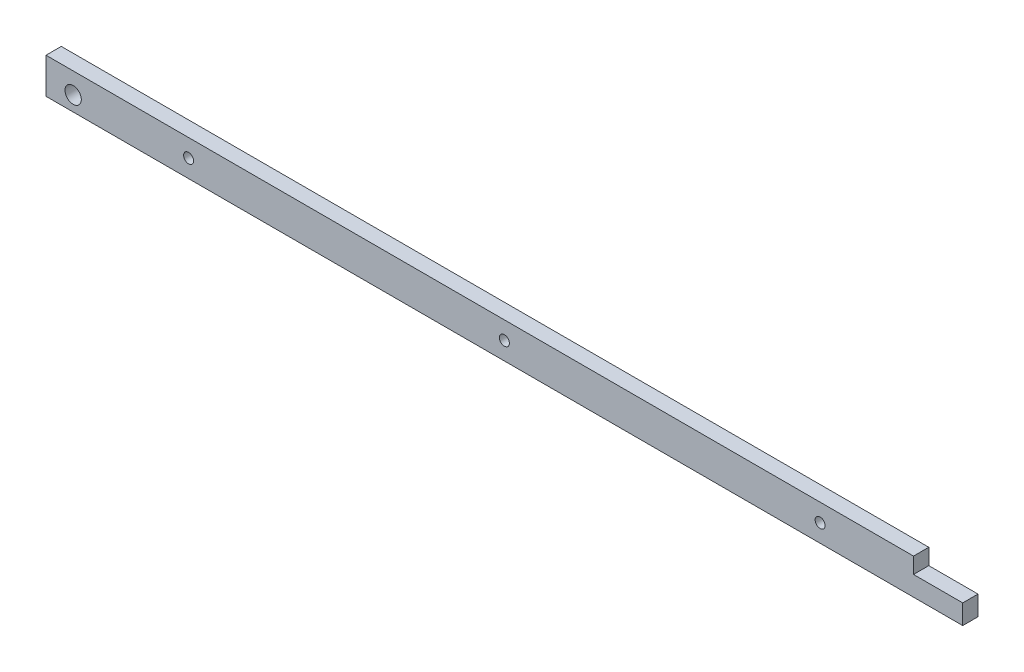
ISO-10303-21;
HEADER;
FILE_DESCRIPTION(('STEP AP214'),'2;1');
FILE_NAME('part.step','',(''),(''),'','','');
FILE_SCHEMA(('AUTOMOTIVE_DESIGN { 1 0 10303 214 1 1 1 1 }'));
ENDSEC;
DATA;
#1=APPLICATION_CONTEXT('core data for automotive mechanical design processes');
#2=APPLICATION_PROTOCOL_DEFINITION('international standard','automotive_design',2000,#1);
#3=PRODUCT_CONTEXT('',#1,'mechanical');
#4=PRODUCT('Part','Part','',(#3));
#5=PRODUCT_RELATED_PRODUCT_CATEGORY('part','',(#4));
#6=PRODUCT_DEFINITION_FORMATION('','',#4);
#7=PRODUCT_DEFINITION_CONTEXT('part definition',#1,'design');
#8=PRODUCT_DEFINITION('design','',#6,#7);
#9=PRODUCT_DEFINITION_SHAPE('','',#8);
#10=(LENGTH_UNIT() NAMED_UNIT(*) SI_UNIT(.MILLI.,.METRE.));
#11=(NAMED_UNIT(*) PLANE_ANGLE_UNIT() SI_UNIT($,.RADIAN.));
#12=(NAMED_UNIT(*) SI_UNIT($,.STERADIAN.) SOLID_ANGLE_UNIT());
#13=UNCERTAINTY_MEASURE_WITH_UNIT(LENGTH_MEASURE(1.E-05),#10,'distance_accuracy_value','');
#14=(GEOMETRIC_REPRESENTATION_CONTEXT(3) GLOBAL_UNCERTAINTY_ASSIGNED_CONTEXT((#13)) GLOBAL_UNIT_ASSIGNED_CONTEXT((#10,
#11,#12)) REPRESENTATION_CONTEXT('',''));
#15=CARTESIAN_POINT('',(0.,0.,0.));
#16=DIRECTION('',(0.,0.,1.));
#17=DIRECTION('',(1.,0.,0.));
#18=AXIS2_PLACEMENT_3D('',#15,#16,#17);
#19=CARTESIAN_POINT('',(0.,0.,7.62));
#20=DIRECTION('',(0.,0.,-1.));
#21=DIRECTION('',(-1.,0.,0.));
#22=AXIS2_PLACEMENT_3D('',#19,#20,#21);
#23=PLANE('',#22);
#24=DIRECTION('',(0.,-1.,0.));
#25=VECTOR('',#24,1.);
#26=CARTESIAN_POINT('',(-1.57426129747797E-13,-4.80058941122077,7.62));
#27=LINE('',#26,#25);
#28=CARTESIAN_POINT('',(0.,12.9644105887762,7.62));
#29=VERTEX_POINT('',#28);
#30=CARTESIAN_POINT('',(-1.57426129747797E-13,-4.80058941122077,7.62));
#31=VERTEX_POINT('',#30);
#32=EDGE_CURVE('E135',#29,#31,#27,.T.);
#33=ORIENTED_EDGE('',*,*,#32,.T.);
#34=DIRECTION('',(1.,0.,0.));
#35=VECTOR('',#34,1.);
#36=CARTESIAN_POINT('',(-1.57426129747797E-13,-4.80058941122077,7.62));
#37=LINE('',#36,#35);
#38=CARTESIAN_POINT('',(457.2,-4.80058941122079,7.62));
#39=VERTEX_POINT('',#38);
#40=EDGE_CURVE('E93',#31,#39,#37,.T.);
#41=ORIENTED_EDGE('',*,*,#40,.T.);
#42=DIRECTION('',(0.,1.,0.));
#43=VECTOR('',#42,1.);
#44=CARTESIAN_POINT('',(457.2,5.01941058877617,7.62));
#45=LINE('',#44,#43);
#46=CARTESIAN_POINT('',(457.2,5.01941058877617,7.62));
#47=VERTEX_POINT('',#46);
#48=EDGE_CURVE('E106',#39,#47,#45,.T.);
#49=ORIENTED_EDGE('',*,*,#48,.T.);
#50=DIRECTION('',(-1.,0.,0.));
#51=VECTOR('',#50,1.);
#52=CARTESIAN_POINT('',(432.660000058,5.01941058877617,7.62));
#53=LINE('',#52,#51);
#54=CARTESIAN_POINT('',(432.660000058,5.01941058877617,7.62));
#55=VERTEX_POINT('',#54);
#56=EDGE_CURVE('E100',#47,#55,#53,.T.);
#57=ORIENTED_EDGE('',*,*,#56,.T.);
#58=DIRECTION('',(0.,1.,0.));
#59=VECTOR('',#58,1.);
#60=CARTESIAN_POINT('',(432.660000058,12.9644105887763,7.62));
#61=LINE('',#60,#59);
#62=CARTESIAN_POINT('',(432.660000058,12.9644105887763,7.62));
#63=VERTEX_POINT('',#62);
#64=EDGE_CURVE('E104',#55,#63,#61,.T.);
#65=ORIENTED_EDGE('',*,*,#64,.T.);
#66=DIRECTION('',(-1.,0.,0.));
#67=VECTOR('',#66,1.);
#68=CARTESIAN_POINT('',(0.,12.9644105887762,7.62));
#69=LINE('',#68,#67);
#70=EDGE_CURVE('E56',#63,#29,#69,.T.);
#71=ORIENTED_EDGE('',*,*,#70,.T.);
#72=EDGE_LOOP('',(#33,#41,#49,#57,#65,#71));
#73=FACE_BOUND('',#72,.T.);
#74=CARTESIAN_POINT('',(386.08,4.08191058877921,7.62));
#75=DIRECTION('',(0.,0.,1.));
#76=DIRECTION('',(1.,0.,0.));
#77=AXIS2_PLACEMENT_3D('',#74,#75,#76);
#78=CIRCLE('',#77,2.48919999999927);
#79=CARTESIAN_POINT('',(383.590800000001,4.08191058877921,7.62));
#80=VERTEX_POINT('',#79);
#81=EDGE_CURVE('E128',#80,#80,#78,.T.);
#82=ORIENTED_EDGE('',*,*,#81,.F.);
#83=EDGE_LOOP('',(#82));
#84=FACE_BOUND('',#83,.T.);
#85=CARTESIAN_POINT('',(228.6,4.08191058877921,7.62));
#86=DIRECTION('',(0.,0.,1.));
#87=DIRECTION('',(1.,0.,0.));
#88=AXIS2_PLACEMENT_3D('',#85,#86,#87);
#89=CIRCLE('',#88,2.48919999999927);
#90=CARTESIAN_POINT('',(226.110800000001,4.08191058877921,7.62));
#91=VERTEX_POINT('',#90);
#92=EDGE_CURVE('E199',#91,#91,#89,.T.);
#93=ORIENTED_EDGE('',*,*,#92,.F.);
#94=EDGE_LOOP('',(#93));
#95=FACE_BOUND('',#94,.T.);
#96=CARTESIAN_POINT('',(71.1199999999998,4.08191058877921,7.62));
#97=DIRECTION('',(0.,0.,1.));
#98=DIRECTION('',(1.,0.,0.));
#99=AXIS2_PLACEMENT_3D('',#96,#97,#98);
#100=CIRCLE('',#99,2.48919999999926);
#101=CARTESIAN_POINT('',(68.6308000000006,4.08191058877921,7.62));
#102=VERTEX_POINT('',#101);
#103=EDGE_CURVE('E193',#102,#102,#100,.T.);
#104=ORIENTED_EDGE('',*,*,#103,.F.);
#105=EDGE_LOOP('',(#104));
#106=FACE_BOUND('',#105,.T.);
#107=CARTESIAN_POINT('',(13.54,2.59941058877618,7.62));
#108=DIRECTION('',(0.,0.,1.));
#109=DIRECTION('',(1.,0.,0.));
#110=AXIS2_PLACEMENT_3D('',#107,#108,#109);
#111=CIRCLE('',#110,4.0635);
#112=CARTESIAN_POINT('',(9.4765,2.59941058877618,7.62));
#113=VERTEX_POINT('',#112);
#114=EDGE_CURVE('E184',#113,#113,#111,.T.);
#115=ORIENTED_EDGE('',*,*,#114,.F.);
#116=EDGE_LOOP('',(#115));
#117=FACE_BOUND('',#116,.T.);
#118=ADVANCED_FACE('F39',(#73,#84,#95,#106,#117),#23,.F.);
#119=CARTESIAN_POINT('',(0.,0.,0.));
#120=DIRECTION('',(0.,0.,-1.));
#121=DIRECTION('',(-1.,0.,0.));
#122=AXIS2_PLACEMENT_3D('',#119,#120,#121);
#123=PLANE('',#122);
#124=CARTESIAN_POINT('',(71.1199999999998,4.08191058877921,0.));
#125=DIRECTION('',(0.,0.,1.));
#126=DIRECTION('',(1.,0.,0.));
#127=AXIS2_PLACEMENT_3D('',#124,#125,#126);
#128=CIRCLE('',#127,2.48919999999926);
#129=CARTESIAN_POINT('',(68.6308000000006,4.08191058877921,0.));
#130=VERTEX_POINT('',#129);
#131=EDGE_CURVE('E190',#130,#130,#128,.T.);
#132=ORIENTED_EDGE('',*,*,#131,.T.);
#133=EDGE_LOOP('',(#132));
#134=FACE_BOUND('',#133,.T.);
#135=CARTESIAN_POINT('',(386.08,4.08191058877921,0.));
#136=DIRECTION('',(0.,0.,1.));
#137=DIRECTION('',(1.,0.,0.));
#138=AXIS2_PLACEMENT_3D('',#135,#136,#137);
#139=CIRCLE('',#138,2.48919999999927);
#140=CARTESIAN_POINT('',(383.590800000001,4.08191058877921,0.));
#141=VERTEX_POINT('',#140);
#142=EDGE_CURVE('E202',#141,#141,#139,.T.);
#143=ORIENTED_EDGE('',*,*,#142,.T.);
#144=EDGE_LOOP('',(#143));
#145=FACE_BOUND('',#144,.T.);
#146=DIRECTION('',(0.,-1.,0.));
#147=VECTOR('',#146,1.);
#148=CARTESIAN_POINT('',(-1.57426129747797E-13,-4.80058941122077,0.));
#149=LINE('',#148,#147);
#150=CARTESIAN_POINT('',(0.,12.9644105887762,0.));
#151=VERTEX_POINT('',#150);
#152=CARTESIAN_POINT('',(-1.57426129747797E-13,-4.80058941122077,0.));
#153=VERTEX_POINT('',#152);
#154=EDGE_CURVE('E124',#151,#153,#149,.T.);
#155=ORIENTED_EDGE('',*,*,#154,.F.);
#156=DIRECTION('',(-1.,0.,0.));
#157=VECTOR('',#156,1.);
#158=CARTESIAN_POINT('',(0.,12.9644105887762,0.));
#159=LINE('',#158,#157);
#160=CARTESIAN_POINT('',(432.660000058,12.9644105887763,0.));
#161=VERTEX_POINT('',#160);
#162=EDGE_CURVE('E85',#161,#151,#159,.T.);
#163=ORIENTED_EDGE('',*,*,#162,.F.);
#164=DIRECTION('',(0.,1.,0.));
#165=VECTOR('',#164,1.);
#166=CARTESIAN_POINT('',(432.660000058,12.9644105887763,0.));
#167=LINE('',#166,#165);
#168=CARTESIAN_POINT('',(432.660000058,5.01941058877617,0.));
#169=VERTEX_POINT('',#168);
#170=EDGE_CURVE('E79',#169,#161,#167,.T.);
#171=ORIENTED_EDGE('',*,*,#170,.F.);
#172=DIRECTION('',(-1.,0.,0.));
#173=VECTOR('',#172,1.);
#174=CARTESIAN_POINT('',(432.660000058,5.01941058877617,0.));
#175=LINE('',#174,#173);
#176=CARTESIAN_POINT('',(457.2,5.01941058877617,0.));
#177=VERTEX_POINT('',#176);
#178=EDGE_CURVE('E114',#177,#169,#175,.T.);
#179=ORIENTED_EDGE('',*,*,#178,.F.);
#180=DIRECTION('',(0.,1.,0.));
#181=VECTOR('',#180,1.);
#182=CARTESIAN_POINT('',(457.2,5.01941058877617,0.));
#183=LINE('',#182,#181);
#184=CARTESIAN_POINT('',(457.2,-4.80058941122079,0.));
#185=VERTEX_POINT('',#184);
#186=EDGE_CURVE('E130',#185,#177,#183,.T.);
#187=ORIENTED_EDGE('',*,*,#186,.F.);
#188=DIRECTION('',(1.,0.,0.));
#189=VECTOR('',#188,1.);
#190=CARTESIAN_POINT('',(-1.57426129747797E-13,-4.80058941122077,0.));
#191=LINE('',#190,#189);
#192=EDGE_CURVE('E127',#153,#185,#191,.T.);
#193=ORIENTED_EDGE('',*,*,#192,.F.);
#194=EDGE_LOOP('',(#155,#163,#171,#179,#187,#193));
#195=FACE_BOUND('',#194,.T.);
#196=CARTESIAN_POINT('',(228.6,4.08191058877921,0.));
#197=DIRECTION('',(0.,0.,1.));
#198=DIRECTION('',(1.,0.,0.));
#199=AXIS2_PLACEMENT_3D('',#196,#197,#198);
#200=CIRCLE('',#199,2.48919999999927);
#201=CARTESIAN_POINT('',(226.110800000001,4.08191058877921,0.));
#202=VERTEX_POINT('',#201);
#203=EDGE_CURVE('E196',#202,#202,#200,.T.);
#204=ORIENTED_EDGE('',*,*,#203,.T.);
#205=EDGE_LOOP('',(#204));
#206=FACE_BOUND('',#205,.T.);
#207=CARTESIAN_POINT('',(13.54,2.59941058877618,0.));
#208=DIRECTION('',(0.,0.,1.));
#209=DIRECTION('',(1.,0.,0.));
#210=AXIS2_PLACEMENT_3D('',#207,#208,#209);
#211=CIRCLE('',#210,4.0635);
#212=CARTESIAN_POINT('',(9.4765,2.59941058877618,0.));
#213=VERTEX_POINT('',#212);
#214=EDGE_CURVE('E187',#213,#213,#211,.T.);
#215=ORIENTED_EDGE('',*,*,#214,.T.);
#216=EDGE_LOOP('',(#215));
#217=FACE_BOUND('',#216,.T.);
#218=ADVANCED_FACE('F144',(#134,#145,#195,#206,#217),#123,.T.);
#219=CARTESIAN_POINT('',(-1.57426129747797E-13,-4.80058941122077,7.62));
#220=DIRECTION('',(1.,0.,0.));
#221=DIRECTION('',(0.,1.,0.));
#222=AXIS2_PLACEMENT_3D('',#219,#220,#221);
#223=PLANE('',#222);
#224=ORIENTED_EDGE('',*,*,#154,.T.);
#225=DIRECTION('',(0.,0.,-1.));
#226=VECTOR('',#225,1.);
#227=CARTESIAN_POINT('',(-1.57426129747797E-13,-4.80058941122077,7.62));
#228=LINE('',#227,#226);
#229=EDGE_CURVE('E11',#31,#153,#228,.T.);
#230=ORIENTED_EDGE('',*,*,#229,.F.);
#231=ORIENTED_EDGE('',*,*,#32,.F.);
#232=DIRECTION('',(0.,0.,-1.));
#233=VECTOR('',#232,1.);
#234=CARTESIAN_POINT('',(0.,12.9644105887762,7.62));
#235=LINE('',#234,#233);
#236=EDGE_CURVE('E120',#29,#151,#235,.T.);
#237=ORIENTED_EDGE('',*,*,#236,.T.);
#238=EDGE_LOOP('',(#224,#230,#231,#237));
#239=FACE_BOUND('',#238,.T.);
#240=ADVANCED_FACE('F41',(#239),#223,.F.);
#241=CARTESIAN_POINT('',(-1.57426129747797E-13,-4.80058941122077,7.62));
#242=DIRECTION('',(0.,1.,0.));
#243=DIRECTION('',(-1.,0.,0.));
#244=AXIS2_PLACEMENT_3D('',#241,#242,#243);
#245=PLANE('',#244);
#246=ORIENTED_EDGE('',*,*,#192,.T.);
#247=DIRECTION('',(0.,0.,-1.));
#248=VECTOR('',#247,1.);
#249=CARTESIAN_POINT('',(457.2,-4.80058941122079,7.62));
#250=LINE('',#249,#248);
#251=EDGE_CURVE('E48',#39,#185,#250,.T.);
#252=ORIENTED_EDGE('',*,*,#251,.F.);
#253=ORIENTED_EDGE('',*,*,#40,.F.);
#254=ORIENTED_EDGE('',*,*,#229,.T.);
#255=EDGE_LOOP('',(#246,#252,#253,#254));
#256=FACE_BOUND('',#255,.T.);
#257=ADVANCED_FACE('F266',(#256),#245,.F.);
#258=CARTESIAN_POINT('',(457.2,5.01941058877617,7.62));
#259=DIRECTION('',(-1.,0.,0.));
#260=DIRECTION('',(0.,-1.,0.));
#261=AXIS2_PLACEMENT_3D('',#258,#259,#260);
#262=PLANE('',#261);
#263=ORIENTED_EDGE('',*,*,#186,.T.);
#264=DIRECTION('',(0.,0.,-1.));
#265=VECTOR('',#264,1.);
#266=CARTESIAN_POINT('',(457.2,5.01941058877617,7.62));
#267=LINE('',#266,#265);
#268=EDGE_CURVE('E115',#47,#177,#267,.T.);
#269=ORIENTED_EDGE('',*,*,#268,.F.);
#270=ORIENTED_EDGE('',*,*,#48,.F.);
#271=ORIENTED_EDGE('',*,*,#251,.T.);
#272=EDGE_LOOP('',(#263,#269,#270,#271));
#273=FACE_BOUND('',#272,.T.);
#274=ADVANCED_FACE('F141',(#273),#262,.F.);
#275=CARTESIAN_POINT('',(432.660000058,5.01941058877617,7.62));
#276=DIRECTION('',(0.,-1.,0.));
#277=DIRECTION('',(0.,0.,-1.));
#278=AXIS2_PLACEMENT_3D('',#275,#276,#277);
#279=PLANE('',#278);
#280=ORIENTED_EDGE('',*,*,#178,.T.);
#281=DIRECTION('',(0.,0.,-1.));
#282=VECTOR('',#281,1.);
#283=CARTESIAN_POINT('',(432.660000058,5.01941058877617,7.62));
#284=LINE('',#283,#282);
#285=EDGE_CURVE('E111',#55,#169,#284,.T.);
#286=ORIENTED_EDGE('',*,*,#285,.F.);
#287=ORIENTED_EDGE('',*,*,#56,.F.);
#288=ORIENTED_EDGE('',*,*,#268,.T.);
#289=EDGE_LOOP('',(#280,#286,#287,#288));
#290=FACE_BOUND('',#289,.T.);
#291=ADVANCED_FACE('F112',(#290),#279,.F.);
#292=CARTESIAN_POINT('',(432.660000058,12.9644105887763,7.62));
#293=DIRECTION('',(-1.,0.,0.));
#294=DIRECTION('',(0.,0.,1.));
#295=AXIS2_PLACEMENT_3D('',#292,#293,#294);
#296=PLANE('',#295);
#297=ORIENTED_EDGE('',*,*,#170,.T.);
#298=DIRECTION('',(0.,0.,-1.));
#299=VECTOR('',#298,1.);
#300=CARTESIAN_POINT('',(432.660000058,12.9644105887763,7.62));
#301=LINE('',#300,#299);
#302=EDGE_CURVE('E116',#63,#161,#301,.T.);
#303=ORIENTED_EDGE('',*,*,#302,.F.);
#304=ORIENTED_EDGE('',*,*,#64,.F.);
#305=ORIENTED_EDGE('',*,*,#285,.T.);
#306=EDGE_LOOP('',(#297,#303,#304,#305));
#307=FACE_BOUND('',#306,.T.);
#308=ADVANCED_FACE('F118',(#307),#296,.F.);
#309=CARTESIAN_POINT('',(0.,12.9644105887762,7.62));
#310=DIRECTION('',(0.,-1.,0.));
#311=DIRECTION('',(1.,0.,0.));
#312=AXIS2_PLACEMENT_3D('',#309,#310,#311);
#313=PLANE('',#312);
#314=ORIENTED_EDGE('',*,*,#162,.T.);
#315=ORIENTED_EDGE('',*,*,#236,.F.);
#316=ORIENTED_EDGE('',*,*,#70,.F.);
#317=ORIENTED_EDGE('',*,*,#302,.T.);
#318=EDGE_LOOP('',(#314,#315,#316,#317));
#319=FACE_BOUND('',#318,.T.);
#320=ADVANCED_FACE('F149',(#319),#313,.F.);
#321=CARTESIAN_POINT('',(386.08,4.08191058877921,7.62));
#322=DIRECTION('',(0.,0.,-1.));
#323=DIRECTION('',(-1.,0.,0.));
#324=AXIS2_PLACEMENT_3D('',#321,#322,#323);
#325=CYLINDRICAL_SURFACE('',#324,2.48919999999927);
#326=CARTESIAN_POINT('',(383.590800000001,4.08191058877921,7.62));
#327=CARTESIAN_POINT('',(383.590800000001,4.08191058877921,7.540625));
#328=CARTESIAN_POINT('',(383.590800000001,4.08191058877921,7.46125));
#329=CARTESIAN_POINT('',(383.590800000001,4.08191058877921,7.3025));
#330=CARTESIAN_POINT('',(383.590800000001,4.08191058877921,7.223125));
#331=CARTESIAN_POINT('',(383.590800000001,4.08191058877921,7.064375));
#332=CARTESIAN_POINT('',(383.590800000001,4.08191058877921,6.985));
#333=CARTESIAN_POINT('',(383.590800000001,4.08191058877921,6.82625));
#334=CARTESIAN_POINT('',(383.590800000001,4.08191058877921,6.746875));
#335=CARTESIAN_POINT('',(383.590800000001,4.08191058877921,6.588125));
#336=CARTESIAN_POINT('',(383.590800000001,4.08191058877921,6.50875));
#337=CARTESIAN_POINT('',(383.590800000001,4.08191058877921,6.35));
#338=CARTESIAN_POINT('',(383.590800000001,4.08191058877921,6.270625));
#339=CARTESIAN_POINT('',(383.590800000001,4.08191058877921,6.111875));
#340=CARTESIAN_POINT('',(383.590800000001,4.08191058877921,6.0325));
#341=CARTESIAN_POINT('',(383.590800000001,4.08191058877921,5.87375));
#342=CARTESIAN_POINT('',(383.590800000001,4.08191058877921,5.794375));
#343=CARTESIAN_POINT('',(383.590800000001,4.08191058877921,5.635625));
#344=CARTESIAN_POINT('',(383.590800000001,4.08191058877921,5.55625));
#345=CARTESIAN_POINT('',(383.590800000001,4.08191058877921,5.3975));
#346=CARTESIAN_POINT('',(383.590800000001,4.08191058877921,5.318125));
#347=CARTESIAN_POINT('',(383.590800000001,4.08191058877921,5.159375));
#348=CARTESIAN_POINT('',(383.590800000001,4.08191058877921,5.08));
#349=CARTESIAN_POINT('',(383.590800000001,4.08191058877921,4.92125));
#350=CARTESIAN_POINT('',(383.590800000001,4.08191058877921,4.841875));
#351=CARTESIAN_POINT('',(383.590800000001,4.08191058877921,4.683125));
#352=CARTESIAN_POINT('',(383.590800000001,4.08191058877921,4.60375));
#353=CARTESIAN_POINT('',(383.590800000001,4.08191058877921,4.445));
#354=CARTESIAN_POINT('',(383.590800000001,4.08191058877921,4.365625));
#355=CARTESIAN_POINT('',(383.590800000001,4.08191058877921,4.206875));
#356=CARTESIAN_POINT('',(383.590800000001,4.08191058877921,4.1275));
#357=CARTESIAN_POINT('',(383.590800000001,4.08191058877921,3.96875));
#358=CARTESIAN_POINT('',(383.590800000001,4.08191058877921,3.889375));
#359=CARTESIAN_POINT('',(383.590800000001,4.08191058877921,3.730625));
#360=CARTESIAN_POINT('',(383.590800000001,4.08191058877921,3.65125));
#361=CARTESIAN_POINT('',(383.590800000001,4.08191058877921,3.4925));
#362=CARTESIAN_POINT('',(383.590800000001,4.08191058877921,3.413125));
#363=CARTESIAN_POINT('',(383.590800000001,4.08191058877921,3.254375));
#364=CARTESIAN_POINT('',(383.590800000001,4.08191058877921,3.175));
#365=CARTESIAN_POINT('',(383.590800000001,4.08191058877921,3.01625));
#366=CARTESIAN_POINT('',(383.590800000001,4.08191058877921,2.936875));
#367=CARTESIAN_POINT('',(383.590800000001,4.08191058877921,2.778125));
#368=CARTESIAN_POINT('',(383.590800000001,4.08191058877921,2.69875));
#369=CARTESIAN_POINT('',(383.590800000001,4.08191058877921,2.54));
#370=CARTESIAN_POINT('',(383.590800000001,4.08191058877921,2.460625));
#371=CARTESIAN_POINT('',(383.590800000001,4.08191058877921,2.301875));
#372=CARTESIAN_POINT('',(383.590800000001,4.08191058877921,2.2225));
#373=CARTESIAN_POINT('',(383.590800000001,4.08191058877921,2.06375));
#374=CARTESIAN_POINT('',(383.590800000001,4.08191058877921,1.984375));
#375=CARTESIAN_POINT('',(383.590800000001,4.08191058877921,1.825625));
#376=CARTESIAN_POINT('',(383.590800000001,4.08191058877921,1.74625));
#377=CARTESIAN_POINT('',(383.590800000001,4.08191058877921,1.5875));
#378=CARTESIAN_POINT('',(383.590800000001,4.08191058877921,1.508125));
#379=CARTESIAN_POINT('',(383.590800000001,4.08191058877921,1.349375));
#380=CARTESIAN_POINT('',(383.590800000001,4.08191058877921,1.27));
#381=CARTESIAN_POINT('',(383.590800000001,4.08191058877921,1.11125));
#382=CARTESIAN_POINT('',(383.590800000001,4.08191058877921,1.031875));
#383=CARTESIAN_POINT('',(383.590800000001,4.08191058877921,0.873125));
#384=CARTESIAN_POINT('',(383.590800000001,4.08191058877921,0.79375));
#385=CARTESIAN_POINT('',(383.590800000001,4.08191058877921,0.635));
#386=CARTESIAN_POINT('',(383.590800000001,4.08191058877921,0.555625));
#387=CARTESIAN_POINT('',(383.590800000001,4.08191058877921,0.396875));
#388=CARTESIAN_POINT('',(383.590800000001,4.08191058877921,0.3175));
#389=CARTESIAN_POINT('',(383.590800000001,4.08191058877921,0.15875));
#390=CARTESIAN_POINT('',(383.590800000001,4.08191058877921,0.0793749999999999));
#391=CARTESIAN_POINT('',(383.590800000001,4.08191058877921,0.));
#392=B_SPLINE_CURVE_WITH_KNOTS('',3,(#326,#327,#328,#329,#330,#331,#332,#333,#334,#335,#336,
#337,#338,#339,#340,#341,#342,#343,#344,#345,#346,#347,#348,#349,#350,#351,#352,#353,#354,#355,
#356,#357,#358,#359,#360,#361,#362,#363,#364,#365,#366,#367,#368,#369,#370,#371,#372,#373,#374,
#375,#376,#377,#378,#379,#380,#381,#382,#383,#384,#385,#386,#387,#388,#389,#390,#391),
.UNSPECIFIED.,.F.,.F.,(4,2,2,2,2,2,2,2,2,2,2,2,2,2,2,2,2,2,2,2,2,2,2,2,2,2,2,2,2,2,2,2,4),(0.,
0.238125,0.47625,0.714375000000001,0.9525,1.190625,1.42875,1.666875,1.905,2.143125,2.38125,
2.619375,2.8575,3.095625,3.33375,3.571875,3.81,4.048125,4.28625,4.524375,4.7625,5.000625,
5.23875,5.476875,5.715,5.953125,6.19125,6.429375,6.6675,6.905625,7.14375,7.381875,7.62),.UNSPECIFIED.);
#393=EDGE_CURVE('BSEAM151',#80,#141,#392,.T.);
#394=ORIENTED_EDGE('',*,*,#81,.T.);
#395=ORIENTED_EDGE('',*,*,#142,.F.);
#396=ORIENTED_EDGE('',*,*,#393,.T.);
#397=ORIENTED_EDGE('',*,*,#393,.F.);
#398=EDGE_LOOP('',(#394,#396,#395,#397));
#399=FACE_BOUND('',#398,.T.);
#400=ADVANCED_FACE('F151',(#399),#325,.F.);
#401=CARTESIAN_POINT('',(228.6,4.08191058877921,7.62));
#402=DIRECTION('',(0.,0.,-1.));
#403=DIRECTION('',(-1.,0.,0.));
#404=AXIS2_PLACEMENT_3D('',#401,#402,#403);
#405=CYLINDRICAL_SURFACE('',#404,2.48919999999927);
#406=CARTESIAN_POINT('',(226.110800000001,4.08191058877921,7.62));
#407=CARTESIAN_POINT('',(226.110800000001,4.08191058877921,7.540625));
#408=CARTESIAN_POINT('',(226.110800000001,4.08191058877921,7.46125));
#409=CARTESIAN_POINT('',(226.110800000001,4.08191058877921,7.3025));
#410=CARTESIAN_POINT('',(226.110800000001,4.08191058877921,7.223125));
#411=CARTESIAN_POINT('',(226.110800000001,4.08191058877921,7.064375));
#412=CARTESIAN_POINT('',(226.110800000001,4.08191058877921,6.985));
#413=CARTESIAN_POINT('',(226.110800000001,4.08191058877921,6.82625));
#414=CARTESIAN_POINT('',(226.110800000001,4.08191058877921,6.746875));
#415=CARTESIAN_POINT('',(226.110800000001,4.08191058877921,6.588125));
#416=CARTESIAN_POINT('',(226.110800000001,4.08191058877921,6.50875));
#417=CARTESIAN_POINT('',(226.110800000001,4.08191058877921,6.35));
#418=CARTESIAN_POINT('',(226.110800000001,4.08191058877921,6.270625));
#419=CARTESIAN_POINT('',(226.110800000001,4.08191058877921,6.111875));
#420=CARTESIAN_POINT('',(226.110800000001,4.08191058877921,6.0325));
#421=CARTESIAN_POINT('',(226.110800000001,4.08191058877921,5.87375));
#422=CARTESIAN_POINT('',(226.110800000001,4.08191058877921,5.794375));
#423=CARTESIAN_POINT('',(226.110800000001,4.08191058877921,5.635625));
#424=CARTESIAN_POINT('',(226.110800000001,4.08191058877921,5.55625));
#425=CARTESIAN_POINT('',(226.110800000001,4.08191058877921,5.3975));
#426=CARTESIAN_POINT('',(226.110800000001,4.08191058877921,5.318125));
#427=CARTESIAN_POINT('',(226.110800000001,4.08191058877921,5.159375));
#428=CARTESIAN_POINT('',(226.110800000001,4.08191058877921,5.08));
#429=CARTESIAN_POINT('',(226.110800000001,4.08191058877921,4.92125));
#430=CARTESIAN_POINT('',(226.110800000001,4.08191058877921,4.841875));
#431=CARTESIAN_POINT('',(226.110800000001,4.08191058877921,4.683125));
#432=CARTESIAN_POINT('',(226.110800000001,4.08191058877921,4.60375));
#433=CARTESIAN_POINT('',(226.110800000001,4.08191058877921,4.445));
#434=CARTESIAN_POINT('',(226.110800000001,4.08191058877921,4.365625));
#435=CARTESIAN_POINT('',(226.110800000001,4.08191058877921,4.206875));
#436=CARTESIAN_POINT('',(226.110800000001,4.08191058877921,4.1275));
#437=CARTESIAN_POINT('',(226.110800000001,4.08191058877921,3.96875));
#438=CARTESIAN_POINT('',(226.110800000001,4.08191058877921,3.889375));
#439=CARTESIAN_POINT('',(226.110800000001,4.08191058877921,3.730625));
#440=CARTESIAN_POINT('',(226.110800000001,4.08191058877921,3.65125));
#441=CARTESIAN_POINT('',(226.110800000001,4.08191058877921,3.4925));
#442=CARTESIAN_POINT('',(226.110800000001,4.08191058877921,3.413125));
#443=CARTESIAN_POINT('',(226.110800000001,4.08191058877921,3.254375));
#444=CARTESIAN_POINT('',(226.110800000001,4.08191058877921,3.175));
#445=CARTESIAN_POINT('',(226.110800000001,4.08191058877921,3.01625));
#446=CARTESIAN_POINT('',(226.110800000001,4.08191058877921,2.936875));
#447=CARTESIAN_POINT('',(226.110800000001,4.08191058877921,2.778125));
#448=CARTESIAN_POINT('',(226.110800000001,4.08191058877921,2.69875));
#449=CARTESIAN_POINT('',(226.110800000001,4.08191058877921,2.54));
#450=CARTESIAN_POINT('',(226.110800000001,4.08191058877921,2.460625));
#451=CARTESIAN_POINT('',(226.110800000001,4.08191058877921,2.301875));
#452=CARTESIAN_POINT('',(226.110800000001,4.08191058877921,2.2225));
#453=CARTESIAN_POINT('',(226.110800000001,4.08191058877921,2.06375));
#454=CARTESIAN_POINT('',(226.110800000001,4.08191058877921,1.984375));
#455=CARTESIAN_POINT('',(226.110800000001,4.08191058877921,1.825625));
#456=CARTESIAN_POINT('',(226.110800000001,4.08191058877921,1.74625));
#457=CARTESIAN_POINT('',(226.110800000001,4.08191058877921,1.5875));
#458=CARTESIAN_POINT('',(226.110800000001,4.08191058877921,1.508125));
#459=CARTESIAN_POINT('',(226.110800000001,4.08191058877921,1.349375));
#460=CARTESIAN_POINT('',(226.110800000001,4.08191058877921,1.27));
#461=CARTESIAN_POINT('',(226.110800000001,4.08191058877921,1.11125));
#462=CARTESIAN_POINT('',(226.110800000001,4.08191058877921,1.031875));
#463=CARTESIAN_POINT('',(226.110800000001,4.08191058877921,0.873125));
#464=CARTESIAN_POINT('',(226.110800000001,4.08191058877921,0.79375));
#465=CARTESIAN_POINT('',(226.110800000001,4.08191058877921,0.635));
#466=CARTESIAN_POINT('',(226.110800000001,4.08191058877921,0.555625));
#467=CARTESIAN_POINT('',(226.110800000001,4.08191058877921,0.396875));
#468=CARTESIAN_POINT('',(226.110800000001,4.08191058877921,0.3175));
#469=CARTESIAN_POINT('',(226.110800000001,4.08191058877921,0.15875));
#470=CARTESIAN_POINT('',(226.110800000001,4.08191058877921,0.0793749999999999));
#471=CARTESIAN_POINT('',(226.110800000001,4.08191058877921,0.));
#472=B_SPLINE_CURVE_WITH_KNOTS('',3,(#406,#407,#408,#409,#410,#411,#412,#413,#414,#415,#416,
#417,#418,#419,#420,#421,#422,#423,#424,#425,#426,#427,#428,#429,#430,#431,#432,#433,#434,#435,
#436,#437,#438,#439,#440,#441,#442,#443,#444,#445,#446,#447,#448,#449,#450,#451,#452,#453,#454,
#455,#456,#457,#458,#459,#460,#461,#462,#463,#464,#465,#466,#467,#468,#469,#470,#471),
.UNSPECIFIED.,.F.,.F.,(4,2,2,2,2,2,2,2,2,2,2,2,2,2,2,2,2,2,2,2,2,2,2,2,2,2,2,2,2,2,2,2,4),(0.,
0.238125,0.47625,0.714375000000001,0.9525,1.190625,1.42875,1.666875,1.905,2.143125,2.38125,
2.619375,2.8575,3.095625,3.33375,3.571875,3.81,4.048125,4.28625,4.524375,4.7625,5.000625,
5.23875,5.476875,5.715,5.953125,6.19125,6.429375,6.6675,6.905625,7.14375,7.381875,7.62),.UNSPECIFIED.);
#473=EDGE_CURVE('BSEAM157',#91,#202,#472,.T.);
#474=ORIENTED_EDGE('',*,*,#92,.T.);
#475=ORIENTED_EDGE('',*,*,#203,.F.);
#476=ORIENTED_EDGE('',*,*,#473,.T.);
#477=ORIENTED_EDGE('',*,*,#473,.F.);
#478=EDGE_LOOP('',(#474,#476,#475,#477));
#479=FACE_BOUND('',#478,.T.);
#480=ADVANCED_FACE('F157',(#479),#405,.F.);
#481=CARTESIAN_POINT('',(71.1199999999998,4.08191058877921,7.62));
#482=DIRECTION('',(0.,0.,-1.));
#483=DIRECTION('',(-1.,0.,0.));
#484=AXIS2_PLACEMENT_3D('',#481,#482,#483);
#485=CYLINDRICAL_SURFACE('',#484,2.48919999999926);
#486=CARTESIAN_POINT('',(68.6308000000006,4.08191058877921,7.62));
#487=CARTESIAN_POINT('',(68.6308000000006,4.08191058877921,7.540625));
#488=CARTESIAN_POINT('',(68.6308000000006,4.08191058877921,7.46125));
#489=CARTESIAN_POINT('',(68.6308000000006,4.08191058877921,7.3025));
#490=CARTESIAN_POINT('',(68.6308000000006,4.08191058877921,7.223125));
#491=CARTESIAN_POINT('',(68.6308000000006,4.08191058877921,7.064375));
#492=CARTESIAN_POINT('',(68.6308000000006,4.08191058877921,6.985));
#493=CARTESIAN_POINT('',(68.6308000000006,4.08191058877921,6.82625));
#494=CARTESIAN_POINT('',(68.6308000000006,4.08191058877921,6.746875));
#495=CARTESIAN_POINT('',(68.6308000000006,4.08191058877921,6.588125));
#496=CARTESIAN_POINT('',(68.6308000000006,4.08191058877921,6.50875));
#497=CARTESIAN_POINT('',(68.6308000000006,4.08191058877921,6.35));
#498=CARTESIAN_POINT('',(68.6308000000006,4.08191058877921,6.270625));
#499=CARTESIAN_POINT('',(68.6308000000006,4.08191058877921,6.111875));
#500=CARTESIAN_POINT('',(68.6308000000006,4.08191058877921,6.0325));
#501=CARTESIAN_POINT('',(68.6308000000006,4.08191058877921,5.87375));
#502=CARTESIAN_POINT('',(68.6308000000006,4.08191058877921,5.794375));
#503=CARTESIAN_POINT('',(68.6308000000006,4.08191058877921,5.635625));
#504=CARTESIAN_POINT('',(68.6308000000006,4.08191058877921,5.55625));
#505=CARTESIAN_POINT('',(68.6308000000006,4.08191058877921,5.3975));
#506=CARTESIAN_POINT('',(68.6308000000006,4.08191058877921,5.318125));
#507=CARTESIAN_POINT('',(68.6308000000006,4.08191058877921,5.159375));
#508=CARTESIAN_POINT('',(68.6308000000006,4.08191058877921,5.08));
#509=CARTESIAN_POINT('',(68.6308000000006,4.08191058877921,4.92125));
#510=CARTESIAN_POINT('',(68.6308000000006,4.08191058877921,4.841875));
#511=CARTESIAN_POINT('',(68.6308000000006,4.08191058877921,4.683125));
#512=CARTESIAN_POINT('',(68.6308000000006,4.08191058877921,4.60375));
#513=CARTESIAN_POINT('',(68.6308000000006,4.08191058877921,4.445));
#514=CARTESIAN_POINT('',(68.6308000000006,4.08191058877921,4.365625));
#515=CARTESIAN_POINT('',(68.6308000000006,4.08191058877921,4.206875));
#516=CARTESIAN_POINT('',(68.6308000000006,4.08191058877921,4.1275));
#517=CARTESIAN_POINT('',(68.6308000000006,4.08191058877921,3.96875));
#518=CARTESIAN_POINT('',(68.6308000000006,4.08191058877921,3.889375));
#519=CARTESIAN_POINT('',(68.6308000000006,4.08191058877921,3.730625));
#520=CARTESIAN_POINT('',(68.6308000000006,4.08191058877921,3.65125));
#521=CARTESIAN_POINT('',(68.6308000000006,4.08191058877921,3.4925));
#522=CARTESIAN_POINT('',(68.6308000000006,4.08191058877921,3.413125));
#523=CARTESIAN_POINT('',(68.6308000000006,4.08191058877921,3.254375));
#524=CARTESIAN_POINT('',(68.6308000000006,4.08191058877921,3.175));
#525=CARTESIAN_POINT('',(68.6308000000006,4.08191058877921,3.01625));
#526=CARTESIAN_POINT('',(68.6308000000006,4.08191058877921,2.936875));
#527=CARTESIAN_POINT('',(68.6308000000006,4.08191058877921,2.778125));
#528=CARTESIAN_POINT('',(68.6308000000006,4.08191058877921,2.69875));
#529=CARTESIAN_POINT('',(68.6308000000006,4.08191058877921,2.54));
#530=CARTESIAN_POINT('',(68.6308000000006,4.08191058877921,2.460625));
#531=CARTESIAN_POINT('',(68.6308000000006,4.08191058877921,2.301875));
#532=CARTESIAN_POINT('',(68.6308000000006,4.08191058877921,2.2225));
#533=CARTESIAN_POINT('',(68.6308000000006,4.08191058877921,2.06375));
#534=CARTESIAN_POINT('',(68.6308000000006,4.08191058877921,1.984375));
#535=CARTESIAN_POINT('',(68.6308000000006,4.08191058877921,1.825625));
#536=CARTESIAN_POINT('',(68.6308000000006,4.08191058877921,1.74625));
#537=CARTESIAN_POINT('',(68.6308000000006,4.08191058877921,1.5875));
#538=CARTESIAN_POINT('',(68.6308000000006,4.08191058877921,1.508125));
#539=CARTESIAN_POINT('',(68.6308000000006,4.08191058877921,1.349375));
#540=CARTESIAN_POINT('',(68.6308000000006,4.08191058877921,1.27));
#541=CARTESIAN_POINT('',(68.6308000000006,4.08191058877921,1.11125));
#542=CARTESIAN_POINT('',(68.6308000000006,4.08191058877921,1.031875));
#543=CARTESIAN_POINT('',(68.6308000000006,4.08191058877921,0.873125));
#544=CARTESIAN_POINT('',(68.6308000000006,4.08191058877921,0.79375));
#545=CARTESIAN_POINT('',(68.6308000000006,4.08191058877921,0.635));
#546=CARTESIAN_POINT('',(68.6308000000006,4.08191058877921,0.555625));
#547=CARTESIAN_POINT('',(68.6308000000006,4.08191058877921,0.396875));
#548=CARTESIAN_POINT('',(68.6308000000006,4.08191058877921,0.3175));
#549=CARTESIAN_POINT('',(68.6308000000006,4.08191058877921,0.15875));
#550=CARTESIAN_POINT('',(68.6308000000006,4.08191058877921,0.0793749999999999));
#551=CARTESIAN_POINT('',(68.6308000000006,4.08191058877921,0.));
#552=B_SPLINE_CURVE_WITH_KNOTS('',3,(#486,#487,#488,#489,#490,#491,#492,#493,#494,#495,#496,
#497,#498,#499,#500,#501,#502,#503,#504,#505,#506,#507,#508,#509,#510,#511,#512,#513,#514,#515,
#516,#517,#518,#519,#520,#521,#522,#523,#524,#525,#526,#527,#528,#529,#530,#531,#532,#533,#534,
#535,#536,#537,#538,#539,#540,#541,#542,#543,#544,#545,#546,#547,#548,#549,#550,#551),
.UNSPECIFIED.,.F.,.F.,(4,2,2,2,2,2,2,2,2,2,2,2,2,2,2,2,2,2,2,2,2,2,2,2,2,2,2,2,2,2,2,2,4),(0.,
0.238125,0.47625,0.714375000000001,0.9525,1.190625,1.42875,1.666875,1.905,2.143125,2.38125,
2.619375,2.8575,3.095625,3.33375,3.571875,3.81,4.048125,4.28625,4.524375,4.7625,5.000625,
5.23875,5.476875,5.715,5.953125,6.19125,6.429375,6.6675,6.905625,7.14375,7.381875,7.62),.UNSPECIFIED.);
#553=EDGE_CURVE('BSEAM171',#102,#130,#552,.T.);
#554=ORIENTED_EDGE('',*,*,#103,.T.);
#555=ORIENTED_EDGE('',*,*,#131,.F.);
#556=ORIENTED_EDGE('',*,*,#553,.T.);
#557=ORIENTED_EDGE('',*,*,#553,.F.);
#558=EDGE_LOOP('',(#554,#556,#555,#557));
#559=FACE_BOUND('',#558,.T.);
#560=ADVANCED_FACE('F171',(#559),#485,.F.);
#561=CARTESIAN_POINT('',(13.54,2.59941058877618,7.62));
#562=DIRECTION('',(0.,0.,-1.));
#563=DIRECTION('',(-1.,0.,0.));
#564=AXIS2_PLACEMENT_3D('',#561,#562,#563);
#565=CYLINDRICAL_SURFACE('',#564,4.0635);
#566=CARTESIAN_POINT('',(9.4765,2.59941058877618,7.62));
#567=CARTESIAN_POINT('',(9.4765,2.59941058877618,7.540625));
#568=CARTESIAN_POINT('',(9.4765,2.59941058877618,7.46125));
#569=CARTESIAN_POINT('',(9.4765,2.59941058877618,7.3025));
#570=CARTESIAN_POINT('',(9.4765,2.59941058877618,7.223125));
#571=CARTESIAN_POINT('',(9.4765,2.59941058877618,7.064375));
#572=CARTESIAN_POINT('',(9.4765,2.59941058877618,6.985));
#573=CARTESIAN_POINT('',(9.4765,2.59941058877618,6.82625));
#574=CARTESIAN_POINT('',(9.4765,2.59941058877618,6.746875));
#575=CARTESIAN_POINT('',(9.4765,2.59941058877618,6.588125));
#576=CARTESIAN_POINT('',(9.4765,2.59941058877618,6.50875));
#577=CARTESIAN_POINT('',(9.4765,2.59941058877618,6.35));
#578=CARTESIAN_POINT('',(9.4765,2.59941058877618,6.270625));
#579=CARTESIAN_POINT('',(9.4765,2.59941058877618,6.111875));
#580=CARTESIAN_POINT('',(9.4765,2.59941058877618,6.0325));
#581=CARTESIAN_POINT('',(9.4765,2.59941058877618,5.87375));
#582=CARTESIAN_POINT('',(9.4765,2.59941058877618,5.794375));
#583=CARTESIAN_POINT('',(9.4765,2.59941058877618,5.635625));
#584=CARTESIAN_POINT('',(9.4765,2.59941058877618,5.55625));
#585=CARTESIAN_POINT('',(9.4765,2.59941058877618,5.3975));
#586=CARTESIAN_POINT('',(9.4765,2.59941058877618,5.318125));
#587=CARTESIAN_POINT('',(9.4765,2.59941058877618,5.159375));
#588=CARTESIAN_POINT('',(9.4765,2.59941058877618,5.08));
#589=CARTESIAN_POINT('',(9.4765,2.59941058877618,4.92125));
#590=CARTESIAN_POINT('',(9.4765,2.59941058877618,4.841875));
#591=CARTESIAN_POINT('',(9.4765,2.59941058877618,4.683125));
#592=CARTESIAN_POINT('',(9.4765,2.59941058877618,4.60375));
#593=CARTESIAN_POINT('',(9.4765,2.59941058877618,4.445));
#594=CARTESIAN_POINT('',(9.4765,2.59941058877618,4.365625));
#595=CARTESIAN_POINT('',(9.4765,2.59941058877618,4.206875));
#596=CARTESIAN_POINT('',(9.4765,2.59941058877618,4.1275));
#597=CARTESIAN_POINT('',(9.4765,2.59941058877618,3.96875));
#598=CARTESIAN_POINT('',(9.4765,2.59941058877618,3.889375));
#599=CARTESIAN_POINT('',(9.4765,2.59941058877618,3.730625));
#600=CARTESIAN_POINT('',(9.4765,2.59941058877618,3.65125));
#601=CARTESIAN_POINT('',(9.4765,2.59941058877618,3.4925));
#602=CARTESIAN_POINT('',(9.4765,2.59941058877618,3.413125));
#603=CARTESIAN_POINT('',(9.4765,2.59941058877618,3.254375));
#604=CARTESIAN_POINT('',(9.4765,2.59941058877618,3.175));
#605=CARTESIAN_POINT('',(9.4765,2.59941058877618,3.01625));
#606=CARTESIAN_POINT('',(9.4765,2.59941058877618,2.936875));
#607=CARTESIAN_POINT('',(9.4765,2.59941058877618,2.778125));
#608=CARTESIAN_POINT('',(9.4765,2.59941058877618,2.69875));
#609=CARTESIAN_POINT('',(9.4765,2.59941058877618,2.54));
#610=CARTESIAN_POINT('',(9.4765,2.59941058877618,2.460625));
#611=CARTESIAN_POINT('',(9.4765,2.59941058877618,2.301875));
#612=CARTESIAN_POINT('',(9.4765,2.59941058877618,2.2225));
#613=CARTESIAN_POINT('',(9.4765,2.59941058877618,2.06375));
#614=CARTESIAN_POINT('',(9.4765,2.59941058877618,1.984375));
#615=CARTESIAN_POINT('',(9.4765,2.59941058877618,1.825625));
#616=CARTESIAN_POINT('',(9.4765,2.59941058877618,1.74625));
#617=CARTESIAN_POINT('',(9.4765,2.59941058877618,1.5875));
#618=CARTESIAN_POINT('',(9.4765,2.59941058877618,1.508125));
#619=CARTESIAN_POINT('',(9.4765,2.59941058877618,1.349375));
#620=CARTESIAN_POINT('',(9.4765,2.59941058877618,1.27));
#621=CARTESIAN_POINT('',(9.4765,2.59941058877618,1.11125));
#622=CARTESIAN_POINT('',(9.4765,2.59941058877618,1.031875));
#623=CARTESIAN_POINT('',(9.4765,2.59941058877618,0.873125));
#624=CARTESIAN_POINT('',(9.4765,2.59941058877618,0.79375));
#625=CARTESIAN_POINT('',(9.4765,2.59941058877618,0.635));
#626=CARTESIAN_POINT('',(9.4765,2.59941058877618,0.555625));
#627=CARTESIAN_POINT('',(9.4765,2.59941058877618,0.396875));
#628=CARTESIAN_POINT('',(9.4765,2.59941058877618,0.3175));
#629=CARTESIAN_POINT('',(9.4765,2.59941058877618,0.15875));
#630=CARTESIAN_POINT('',(9.4765,2.59941058877618,0.0793749999999999));
#631=CARTESIAN_POINT('',(9.4765,2.59941058877618,0.));
#632=B_SPLINE_CURVE_WITH_KNOTS('',3,(#566,#567,#568,#569,#570,#571,#572,#573,#574,#575,#576,
#577,#578,#579,#580,#581,#582,#583,#584,#585,#586,#587,#588,#589,#590,#591,#592,#593,#594,#595,
#596,#597,#598,#599,#600,#601,#602,#603,#604,#605,#606,#607,#608,#609,#610,#611,#612,#613,#614,
#615,#616,#617,#618,#619,#620,#621,#622,#623,#624,#625,#626,#627,#628,#629,#630,#631),
.UNSPECIFIED.,.F.,.F.,(4,2,2,2,2,2,2,2,2,2,2,2,2,2,2,2,2,2,2,2,2,2,2,2,2,2,2,2,2,2,2,2,4),(0.,
0.238125,0.47625,0.714375000000001,0.9525,1.190625,1.42875,1.666875,1.905,2.143125,2.38125,
2.619375,2.8575,3.095625,3.33375,3.571875,3.81,4.048125,4.28625,4.524375,4.7625,5.000625,
5.23875,5.476875,5.715,5.953125,6.19125,6.429375,6.6675,6.905625,7.14375,7.381875,7.62),.UNSPECIFIED.);
#633=EDGE_CURVE('BSEAM175',#113,#213,#632,.T.);
#634=ORIENTED_EDGE('',*,*,#114,.T.);
#635=ORIENTED_EDGE('',*,*,#214,.F.);
#636=ORIENTED_EDGE('',*,*,#633,.T.);
#637=ORIENTED_EDGE('',*,*,#633,.F.);
#638=EDGE_LOOP('',(#634,#636,#635,#637));
#639=FACE_BOUND('',#638,.T.);
#640=ADVANCED_FACE('F175',(#639),#565,.F.);
#641=CLOSED_SHELL('',(#118,#218,#240,#257,#274,#291,#308,#320,#400,#480,#560,#640));
#642=MANIFOLD_SOLID_BREP('B2',#641);
#643=ADVANCED_BREP_SHAPE_REPRESENTATION('',(#18,#642),#14);
#644=SHAPE_DEFINITION_REPRESENTATION(#9,#643);
ENDSEC;
END-ISO-10303-21;
